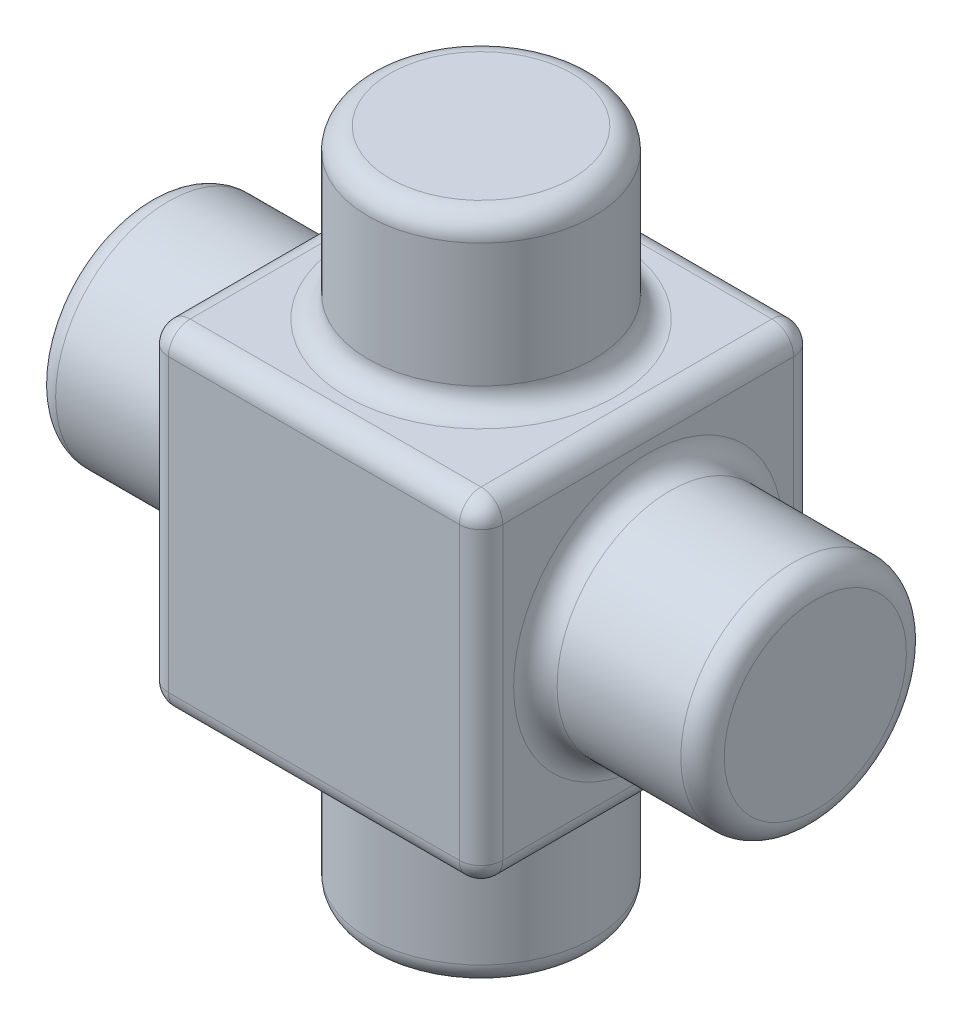
ISO-10303-21;
HEADER;
FILE_DESCRIPTION(('STEP AP214'),'2;1');
FILE_NAME('part.step','',(''),(''),'','','');
FILE_SCHEMA(('AUTOMOTIVE_DESIGN { 1 0 10303 214 1 1 1 1 }'));
ENDSEC;
DATA;
#1=APPLICATION_CONTEXT('core data for automotive mechanical design processes');
#2=APPLICATION_PROTOCOL_DEFINITION('international standard','automotive_design',2000,#1);
#3=PRODUCT_CONTEXT('',#1,'mechanical');
#4=PRODUCT('Part','Part','',(#3));
#5=PRODUCT_RELATED_PRODUCT_CATEGORY('part','',(#4));
#6=PRODUCT_DEFINITION_FORMATION('','',#4);
#7=PRODUCT_DEFINITION_CONTEXT('part definition',#1,'design');
#8=PRODUCT_DEFINITION('design','',#6,#7);
#9=PRODUCT_DEFINITION_SHAPE('','',#8);
#10=(LENGTH_UNIT() NAMED_UNIT(*) SI_UNIT(.MILLI.,.METRE.));
#11=(NAMED_UNIT(*) PLANE_ANGLE_UNIT() SI_UNIT($,.RADIAN.));
#12=(NAMED_UNIT(*) SI_UNIT($,.STERADIAN.) SOLID_ANGLE_UNIT());
#13=UNCERTAINTY_MEASURE_WITH_UNIT(LENGTH_MEASURE(1.E-05),#10,'distance_accuracy_value','');
#14=(GEOMETRIC_REPRESENTATION_CONTEXT(3) GLOBAL_UNCERTAINTY_ASSIGNED_CONTEXT((#13)) GLOBAL_UNIT_ASSIGNED_CONTEXT((#10,
#11,#12)) REPRESENTATION_CONTEXT('',''));
#15=CARTESIAN_POINT('',(0.,0.,0.));
#16=DIRECTION('',(0.,0.,1.));
#17=DIRECTION('',(1.,0.,0.));
#18=AXIS2_PLACEMENT_3D('',#15,#16,#17);
#19=CARTESIAN_POINT('',(0.,25.4,25.4));
#20=DIRECTION('',(0.,0.,-1.));
#21=DIRECTION('',(-1.,0.,0.));
#22=AXIS2_PLACEMENT_3D('',#19,#20,#21);
#23=PLANE('',#22);
#24=DIRECTION('',(1.,0.,0.));
#25=VECTOR('',#24,1.);
#26=CARTESIAN_POINT('',(-25.4,22.098,25.4));
#27=LINE('',#26,#25);
#28=CARTESIAN_POINT('',(22.098,22.098,25.4));
#29=VERTEX_POINT('',#28);
#30=CARTESIAN_POINT('',(-22.098,22.098,25.4));
#31=VERTEX_POINT('',#30);
#32=EDGE_CURVE('E45',#29,#31,#27,.F.);
#33=ORIENTED_EDGE('',*,*,#32,.T.);
#34=DIRECTION('',(0.,-1.,0.));
#35=VECTOR('',#34,1.);
#36=CARTESIAN_POINT('',(-22.098,-25.4,25.4));
#37=LINE('',#36,#35);
#38=CARTESIAN_POINT('',(-22.098,-22.098,25.4));
#39=VERTEX_POINT('',#38);
#40=EDGE_CURVE('E11',#31,#39,#37,.T.);
#41=ORIENTED_EDGE('',*,*,#40,.T.);
#42=DIRECTION('',(1.,0.,0.));
#43=VECTOR('',#42,1.);
#44=CARTESIAN_POINT('',(0.,-22.098,25.4));
#45=LINE('',#44,#43);
#46=CARTESIAN_POINT('',(22.098,-22.098,25.4));
#47=VERTEX_POINT('',#46);
#48=EDGE_CURVE('E217',#39,#47,#45,.T.);
#49=ORIENTED_EDGE('',*,*,#48,.T.);
#50=DIRECTION('',(0.,-1.,0.));
#51=VECTOR('',#50,1.);
#52=CARTESIAN_POINT('',(22.098,25.4,25.4));
#53=LINE('',#52,#51);
#54=EDGE_CURVE('E56',#47,#29,#53,.F.);
#55=ORIENTED_EDGE('',*,*,#54,.T.);
#56=EDGE_LOOP('',(#33,#41,#49,#55));
#57=FACE_BOUND('',#56,.T.);
#58=ADVANCED_FACE('F36',(#57),#23,.F.);
#59=CARTESIAN_POINT('',(25.4,25.4,0.));
#60=DIRECTION('',(-1.,0.,0.));
#61=DIRECTION('',(0.,0.,1.));
#62=AXIS2_PLACEMENT_3D('',#59,#60,#61);
#63=PLANE('',#62);
#64=CARTESIAN_POINT('',(25.4,0.,0.));
#65=DIRECTION('',(-1.,0.,0.));
#66=DIRECTION('',(0.,0.,1.));
#67=AXIS2_PLACEMENT_3D('',#64,#65,#66);
#68=CIRCLE('',#67,20.447);
#69=CARTESIAN_POINT('',(25.4,0.,20.447));
#70=VERTEX_POINT('',#69);
#71=EDGE_CURVE('E202',#70,#70,#68,.T.);
#72=ORIENTED_EDGE('',*,*,#71,.T.);
#73=EDGE_LOOP('',(#72));
#74=FACE_BOUND('',#73,.T.);
#75=DIRECTION('',(0.,0.,-1.));
#76=VECTOR('',#75,1.);
#77=CARTESIAN_POINT('',(25.4,-22.098,0.));
#78=LINE('',#77,#76);
#79=CARTESIAN_POINT('',(25.4,-22.098,22.098));
#80=VERTEX_POINT('',#79);
#81=CARTESIAN_POINT('',(25.4,-22.098,-22.098));
#82=VERTEX_POINT('',#81);
#83=EDGE_CURVE('E142',#80,#82,#78,.T.);
#84=ORIENTED_EDGE('',*,*,#83,.T.);
#85=DIRECTION('',(0.,-1.,0.));
#86=VECTOR('',#85,1.);
#87=CARTESIAN_POINT('',(25.4,25.4,-22.098));
#88=LINE('',#87,#86);
#89=CARTESIAN_POINT('',(25.4,22.098,-22.098));
#90=VERTEX_POINT('',#89);
#91=EDGE_CURVE('E199',#82,#90,#88,.F.);
#92=ORIENTED_EDGE('',*,*,#91,.T.);
#93=DIRECTION('',(0.,0.,-1.));
#94=VECTOR('',#93,1.);
#95=CARTESIAN_POINT('',(25.4,22.098,25.4));
#96=LINE('',#95,#94);
#97=CARTESIAN_POINT('',(25.4,22.098,22.098));
#98=VERTEX_POINT('',#97);
#99=EDGE_CURVE('E196',#90,#98,#96,.F.);
#100=ORIENTED_EDGE('',*,*,#99,.T.);
#101=DIRECTION('',(0.,-1.,0.));
#102=VECTOR('',#101,1.);
#103=CARTESIAN_POINT('',(25.4,25.4,22.098));
#104=LINE('',#103,#102);
#105=EDGE_CURVE('E194',#98,#80,#104,.T.);
#106=ORIENTED_EDGE('',*,*,#105,.T.);
#107=EDGE_LOOP('',(#84,#92,#100,#106));
#108=FACE_BOUND('',#107,.T.);
#109=ADVANCED_FACE('F332',(#74,#108),#63,.F.);
#110=CARTESIAN_POINT('',(0.,25.4,-25.4));
#111=DIRECTION('',(0.,0.,-1.));
#112=DIRECTION('',(-1.,0.,0.));
#113=AXIS2_PLACEMENT_3D('',#110,#111,#112);
#114=PLANE('',#113);
#115=DIRECTION('',(1.,0.,0.));
#116=VECTOR('',#115,1.);
#117=CARTESIAN_POINT('',(-25.4,-22.098,-25.4));
#118=LINE('',#117,#116);
#119=CARTESIAN_POINT('',(22.098,-22.098,-25.4));
#120=VERTEX_POINT('',#119);
#121=CARTESIAN_POINT('',(-22.098,-22.098,-25.4));
#122=VERTEX_POINT('',#121);
#123=EDGE_CURVE('E189',#120,#122,#118,.F.);
#124=ORIENTED_EDGE('',*,*,#123,.T.);
#125=DIRECTION('',(0.,-1.,0.));
#126=VECTOR('',#125,1.);
#127=CARTESIAN_POINT('',(-22.098,25.4,-25.4));
#128=LINE('',#127,#126);
#129=CARTESIAN_POINT('',(-22.098,22.098,-25.4));
#130=VERTEX_POINT('',#129);
#131=EDGE_CURVE('E191',#122,#130,#128,.F.);
#132=ORIENTED_EDGE('',*,*,#131,.T.);
#133=DIRECTION('',(1.,0.,0.));
#134=VECTOR('',#133,1.);
#135=CARTESIAN_POINT('',(0.,22.098,-25.4));
#136=LINE('',#135,#134);
#137=CARTESIAN_POINT('',(22.098,22.098,-25.4));
#138=VERTEX_POINT('',#137);
#139=EDGE_CURVE('E185',#130,#138,#136,.T.);
#140=ORIENTED_EDGE('',*,*,#139,.T.);
#141=DIRECTION('',(0.,-1.,0.));
#142=VECTOR('',#141,1.);
#143=CARTESIAN_POINT('',(22.098,-25.4,-25.4));
#144=LINE('',#143,#142);
#145=EDGE_CURVE('E187',#138,#120,#144,.T.);
#146=ORIENTED_EDGE('',*,*,#145,.T.);
#147=EDGE_LOOP('',(#124,#132,#140,#146));
#148=FACE_BOUND('',#147,.T.);
#149=ADVANCED_FACE('F337',(#148),#114,.T.);
#150=CARTESIAN_POINT('',(-25.4,25.4,0.));
#151=DIRECTION('',(-1.,0.,0.));
#152=DIRECTION('',(0.,0.,1.));
#153=AXIS2_PLACEMENT_3D('',#150,#151,#152);
#154=PLANE('',#153);
#155=CARTESIAN_POINT('',(-25.4,0.,0.));
#156=DIRECTION('',(-1.,0.,0.));
#157=DIRECTION('',(0.,0.,1.));
#158=AXIS2_PLACEMENT_3D('',#155,#156,#157);
#159=CIRCLE('',#158,20.447);
#160=CARTESIAN_POINT('',(-25.4,0.,20.447));
#161=VERTEX_POINT('',#160);
#162=EDGE_CURVE('E182',#161,#161,#159,.F.);
#163=ORIENTED_EDGE('',*,*,#162,.T.);
#164=EDGE_LOOP('',(#163));
#165=FACE_BOUND('',#164,.T.);
#166=DIRECTION('',(0.,-1.,0.));
#167=VECTOR('',#166,1.);
#168=CARTESIAN_POINT('',(-25.4,25.4,-22.098));
#169=LINE('',#168,#167);
#170=CARTESIAN_POINT('',(-25.4,22.098,-22.098));
#171=VERTEX_POINT('',#170);
#172=CARTESIAN_POINT('',(-25.4,-22.098,-22.098));
#173=VERTEX_POINT('',#172);
#174=EDGE_CURVE('E177',#171,#173,#169,.T.);
#175=ORIENTED_EDGE('',*,*,#174,.T.);
#176=DIRECTION('',(0.,0.,-1.));
#177=VECTOR('',#176,1.);
#178=CARTESIAN_POINT('',(-25.4,-22.098,25.4));
#179=LINE('',#178,#177);
#180=CARTESIAN_POINT('',(-25.4,-22.098,22.098));
#181=VERTEX_POINT('',#180);
#182=EDGE_CURVE('E179',#173,#181,#179,.F.);
#183=ORIENTED_EDGE('',*,*,#182,.T.);
#184=DIRECTION('',(0.,-1.,0.));
#185=VECTOR('',#184,1.);
#186=CARTESIAN_POINT('',(-25.4,25.4,22.098));
#187=LINE('',#186,#185);
#188=CARTESIAN_POINT('',(-25.4,22.098,22.098));
#189=VERTEX_POINT('',#188);
#190=EDGE_CURVE('E173',#181,#189,#187,.F.);
#191=ORIENTED_EDGE('',*,*,#190,.T.);
#192=DIRECTION('',(0.,0.,-1.));
#193=VECTOR('',#192,1.);
#194=CARTESIAN_POINT('',(-25.4,22.098,0.));
#195=LINE('',#194,#193);
#196=EDGE_CURVE('E175',#189,#171,#195,.T.);
#197=ORIENTED_EDGE('',*,*,#196,.T.);
#198=EDGE_LOOP('',(#175,#183,#191,#197));
#199=FACE_BOUND('',#198,.T.);
#200=ADVANCED_FACE('F462',(#165,#199),#154,.T.);
#201=CARTESIAN_POINT('',(0.,25.4,0.));
#202=DIRECTION('',(0.,1.,0.));
#203=DIRECTION('',(0.,0.,1.));
#204=AXIS2_PLACEMENT_3D('',#201,#202,#203);
#205=PLANE('',#204);
#206=CARTESIAN_POINT('',(0.,25.4,0.));
#207=DIRECTION('',(0.,1.,0.));
#208=DIRECTION('',(0.,0.,1.));
#209=AXIS2_PLACEMENT_3D('',#206,#207,#208);
#210=CIRCLE('',#209,20.447);
#211=CARTESIAN_POINT('',(0.,25.4,20.447));
#212=VERTEX_POINT('',#211);
#213=EDGE_CURVE('E214',#212,#212,#210,.F.);
#214=ORIENTED_EDGE('',*,*,#213,.T.);
#215=EDGE_LOOP('',(#214));
#216=FACE_BOUND('',#215,.T.);
#217=DIRECTION('',(1.,0.,0.));
#218=VECTOR('',#217,1.);
#219=CARTESIAN_POINT('',(0.,25.4,-22.098));
#220=LINE('',#219,#218);
#221=CARTESIAN_POINT('',(22.098,25.4,-22.098));
#222=VERTEX_POINT('',#221);
#223=CARTESIAN_POINT('',(-22.098,25.4,-22.098));
#224=VERTEX_POINT('',#223);
#225=EDGE_CURVE('E209',#222,#224,#220,.F.);
#226=ORIENTED_EDGE('',*,*,#225,.T.);
#227=DIRECTION('',(0.,0.,-1.));
#228=VECTOR('',#227,1.);
#229=CARTESIAN_POINT('',(-22.098,25.4,0.));
#230=LINE('',#229,#228);
#231=CARTESIAN_POINT('',(-22.098,25.4,22.098));
#232=VERTEX_POINT('',#231);
#233=EDGE_CURVE('E211',#224,#232,#230,.F.);
#234=ORIENTED_EDGE('',*,*,#233,.T.);
#235=DIRECTION('',(1.,0.,0.));
#236=VECTOR('',#235,1.);
#237=CARTESIAN_POINT('',(25.4,25.4,22.098));
#238=LINE('',#237,#236);
#239=CARTESIAN_POINT('',(22.098,25.4,22.098));
#240=VERTEX_POINT('',#239);
#241=EDGE_CURVE('E205',#232,#240,#238,.T.);
#242=ORIENTED_EDGE('',*,*,#241,.T.);
#243=DIRECTION('',(0.,0.,-1.));
#244=VECTOR('',#243,1.);
#245=CARTESIAN_POINT('',(22.098,25.4,-25.4));
#246=LINE('',#245,#244);
#247=EDGE_CURVE('E207',#240,#222,#246,.T.);
#248=ORIENTED_EDGE('',*,*,#247,.T.);
#249=EDGE_LOOP('',(#226,#234,#242,#248));
#250=FACE_BOUND('',#249,.T.);
#251=ADVANCED_FACE('F451',(#216,#250),#205,.T.);
#252=CARTESIAN_POINT('',(0.,-25.4,0.));
#253=DIRECTION('',(0.,1.,0.));
#254=DIRECTION('',(0.,0.,1.));
#255=AXIS2_PLACEMENT_3D('',#252,#253,#254);
#256=PLANE('',#255);
#257=CARTESIAN_POINT('',(0.,-25.4,0.));
#258=DIRECTION('',(0.,1.,0.));
#259=DIRECTION('',(0.,0.,1.));
#260=AXIS2_PLACEMENT_3D('',#257,#258,#259);
#261=CIRCLE('',#260,20.447);
#262=CARTESIAN_POINT('',(0.,-25.4,20.447));
#263=VERTEX_POINT('',#262);
#264=EDGE_CURVE('E170',#263,#263,#261,.T.);
#265=ORIENTED_EDGE('',*,*,#264,.T.);
#266=EDGE_LOOP('',(#265));
#267=FACE_BOUND('',#266,.T.);
#268=DIRECTION('',(1.,0.,0.));
#269=VECTOR('',#268,1.);
#270=CARTESIAN_POINT('',(0.,-25.4,22.098));
#271=LINE('',#270,#269);
#272=CARTESIAN_POINT('',(22.098,-25.4,22.098));
#273=VERTEX_POINT('',#272);
#274=CARTESIAN_POINT('',(-22.098,-25.4,22.098));
#275=VERTEX_POINT('',#274);
#276=EDGE_CURVE('E129',#273,#275,#271,.F.);
#277=ORIENTED_EDGE('',*,*,#276,.T.);
#278=DIRECTION('',(0.,0.,-1.));
#279=VECTOR('',#278,1.);
#280=CARTESIAN_POINT('',(-22.098,-25.4,-25.4));
#281=LINE('',#280,#279);
#282=CARTESIAN_POINT('',(-22.098,-25.4,-22.098));
#283=VERTEX_POINT('',#282);
#284=EDGE_CURVE('E168',#275,#283,#281,.T.);
#285=ORIENTED_EDGE('',*,*,#284,.T.);
#286=DIRECTION('',(1.,0.,0.));
#287=VECTOR('',#286,1.);
#288=CARTESIAN_POINT('',(25.4,-25.4,-22.098));
#289=LINE('',#288,#287);
#290=CARTESIAN_POINT('',(22.098,-25.4,-22.098));
#291=VERTEX_POINT('',#290);
#292=EDGE_CURVE('E132',#283,#291,#289,.T.);
#293=ORIENTED_EDGE('',*,*,#292,.T.);
#294=DIRECTION('',(0.,0.,-1.));
#295=VECTOR('',#294,1.);
#296=CARTESIAN_POINT('',(22.098,-25.4,0.));
#297=LINE('',#296,#295);
#298=EDGE_CURVE('E124',#291,#273,#297,.F.);
#299=ORIENTED_EDGE('',*,*,#298,.T.);
#300=EDGE_LOOP('',(#277,#285,#293,#299));
#301=FACE_BOUND('',#300,.T.);
#302=ADVANCED_FACE('F126',(#267,#301),#256,.F.);
#303=CARTESIAN_POINT('',(0.,-50.8,0.));
#304=DIRECTION('',(0.,1.,0.));
#305=DIRECTION('',(0.,0.,1.));
#306=AXIS2_PLACEMENT_3D('',#303,#304,#305);
#307=PLANE('',#306);
#308=CARTESIAN_POINT('',(0.,-50.8,0.));
#309=DIRECTION('',(0.,1.,0.));
#310=DIRECTION('',(0.,0.,1.));
#311=AXIS2_PLACEMENT_3D('',#308,#309,#310);
#312=CIRCLE('',#311,13.843);
#313=CARTESIAN_POINT('',(0.,-50.8,13.843));
#314=VERTEX_POINT('',#313);
#315=EDGE_CURVE('E285',#314,#314,#312,.F.);
#316=ORIENTED_EDGE('',*,*,#315,.T.);
#317=EDGE_LOOP('',(#316));
#318=FACE_BOUND('',#317,.T.);
#319=ADVANCED_FACE('F474',(#318),#307,.F.);
#320=CARTESIAN_POINT('',(0.,50.8,0.));
#321=DIRECTION('',(0.,-1.,0.));
#322=DIRECTION('',(0.,0.,-1.));
#323=AXIS2_PLACEMENT_3D('',#320,#321,#322);
#324=CYLINDRICAL_SURFACE('',#323,17.145);
#325=CARTESIAN_POINT('',(0.,-47.498,0.));
#326=DIRECTION('',(0.,1.,0.));
#327=DIRECTION('',(0.,0.,1.));
#328=AXIS2_PLACEMENT_3D('',#325,#326,#327);
#329=CIRCLE('',#328,17.145);
#330=CARTESIAN_POINT('',(0.,-47.498,17.145));
#331=VERTEX_POINT('',#330);
#332=EDGE_CURVE('E280',#331,#331,#329,.T.);
#333=ORIENTED_EDGE('',*,*,#332,.T.);
#334=EDGE_LOOP('',(#333));
#335=FACE_BOUND('',#334,.T.);
#336=CARTESIAN_POINT('',(0.,-28.702,0.));
#337=DIRECTION('',(0.,1.,0.));
#338=DIRECTION('',(0.,0.,1.));
#339=AXIS2_PLACEMENT_3D('',#336,#337,#338);
#340=CIRCLE('',#339,17.145);
#341=CARTESIAN_POINT('',(0.,-28.702,17.145));
#342=VERTEX_POINT('',#341);
#343=EDGE_CURVE('E274',#342,#342,#340,.F.);
#344=ORIENTED_EDGE('',*,*,#343,.T.);
#345=EDGE_LOOP('',(#344));
#346=FACE_BOUND('',#345,.T.);
#347=ADVANCED_FACE('F481',(#335,#346),#324,.T.);
#348=CARTESIAN_POINT('',(0.,47.498,0.));
#349=DIRECTION('',(0.,1.,0.));
#350=DIRECTION('',(0.,0.,1.));
#351=AXIS2_PLACEMENT_3D('',#348,#349,#350);
#352=CIRCLE('',#351,17.145);
#353=CARTESIAN_POINT('',(0.,47.498,17.145));
#354=VERTEX_POINT('',#353);
#355=EDGE_CURVE('E305',#354,#354,#352,.F.);
#356=ORIENTED_EDGE('',*,*,#355,.T.);
#357=EDGE_LOOP('',(#356));
#358=FACE_BOUND('',#357,.T.);
#359=CARTESIAN_POINT('',(0.,28.702,0.));
#360=DIRECTION('',(0.,1.,0.));
#361=DIRECTION('',(0.,0.,1.));
#362=AXIS2_PLACEMENT_3D('',#359,#360,#361);
#363=CIRCLE('',#362,17.145);
#364=CARTESIAN_POINT('',(0.,28.702,17.145));
#365=VERTEX_POINT('',#364);
#366=EDGE_CURVE('E302',#365,#365,#363,.T.);
#367=ORIENTED_EDGE('',*,*,#366,.T.);
#368=EDGE_LOOP('',(#367));
#369=FACE_BOUND('',#368,.T.);
#370=ADVANCED_FACE('F477',(#358,#369),#324,.T.);
#371=CARTESIAN_POINT('',(0.,50.8,0.));
#372=DIRECTION('',(0.,1.,0.));
#373=DIRECTION('',(0.,0.,1.));
#374=AXIS2_PLACEMENT_3D('',#371,#372,#373);
#375=PLANE('',#374);
#376=CARTESIAN_POINT('',(0.,50.8,0.));
#377=DIRECTION('',(0.,1.,0.));
#378=DIRECTION('',(0.,0.,1.));
#379=AXIS2_PLACEMENT_3D('',#376,#377,#378);
#380=CIRCLE('',#379,13.843);
#381=CARTESIAN_POINT('',(0.,50.8,13.843));
#382=VERTEX_POINT('',#381);
#383=EDGE_CURVE('E299',#382,#382,#380,.T.);
#384=ORIENTED_EDGE('',*,*,#383,.T.);
#385=EDGE_LOOP('',(#384));
#386=FACE_BOUND('',#385,.T.);
#387=ADVANCED_FACE('F480',(#386),#375,.T.);
#388=CARTESIAN_POINT('',(-50.8,0.,0.));
#389=DIRECTION('',(1.,0.,0.));
#390=DIRECTION('',(0.,0.,1.));
#391=AXIS2_PLACEMENT_3D('',#388,#389,#390);
#392=PLANE('',#391);
#393=CARTESIAN_POINT('',(-50.8,0.,0.));
#394=DIRECTION('',(1.,0.,0.));
#395=DIRECTION('',(0.,1.,0.));
#396=AXIS2_PLACEMENT_3D('',#393,#394,#395);
#397=CIRCLE('',#396,13.843);
#398=CARTESIAN_POINT('',(-50.8,13.843,0.));
#399=VERTEX_POINT('',#398);
#400=EDGE_CURVE('E308',#399,#399,#397,.F.);
#401=ORIENTED_EDGE('',*,*,#400,.T.);
#402=EDGE_LOOP('',(#401));
#403=FACE_BOUND('',#402,.T.);
#404=ADVANCED_FACE('F488',(#403),#392,.F.);
#405=CARTESIAN_POINT('',(50.8,0.,0.));
#406=DIRECTION('',(-1.,0.,0.));
#407=DIRECTION('',(0.,-1.,0.));
#408=AXIS2_PLACEMENT_3D('',#405,#406,#407);
#409=CYLINDRICAL_SURFACE('',#408,17.145);
#410=CARTESIAN_POINT('',(-47.498,0.,0.));
#411=DIRECTION('',(1.,0.,0.));
#412=DIRECTION('',(0.,1.,0.));
#413=AXIS2_PLACEMENT_3D('',#410,#411,#412);
#414=CIRCLE('',#413,17.145);
#415=CARTESIAN_POINT('',(-47.498,17.145,0.));
#416=VERTEX_POINT('',#415);
#417=EDGE_CURVE('E160',#416,#416,#414,.T.);
#418=ORIENTED_EDGE('',*,*,#417,.T.);
#419=EDGE_LOOP('',(#418));
#420=FACE_BOUND('',#419,.T.);
#421=CARTESIAN_POINT('',(-28.702,0.,0.));
#422=DIRECTION('',(-1.,0.,0.));
#423=DIRECTION('',(0.,0.,1.));
#424=AXIS2_PLACEMENT_3D('',#421,#422,#423);
#425=CIRCLE('',#424,17.145);
#426=CARTESIAN_POINT('',(-28.702,0.,17.145));
#427=VERTEX_POINT('',#426);
#428=EDGE_CURVE('E163',#427,#427,#425,.T.);
#429=ORIENTED_EDGE('',*,*,#428,.T.);
#430=EDGE_LOOP('',(#429));
#431=FACE_BOUND('',#430,.T.);
#432=ADVANCED_FACE('F313',(#420,#431),#409,.T.);
#433=CARTESIAN_POINT('',(47.498,0.,0.));
#434=DIRECTION('',(1.,0.,0.));
#435=DIRECTION('',(0.,1.,0.));
#436=AXIS2_PLACEMENT_3D('',#433,#434,#435);
#437=CIRCLE('',#436,17.145);
#438=CARTESIAN_POINT('',(47.498,17.145,0.));
#439=VERTEX_POINT('',#438);
#440=EDGE_CURVE('E293',#439,#439,#437,.F.);
#441=ORIENTED_EDGE('',*,*,#440,.T.);
#442=EDGE_LOOP('',(#441));
#443=FACE_BOUND('',#442,.T.);
#444=CARTESIAN_POINT('',(28.702,0.,0.));
#445=DIRECTION('',(-1.,0.,0.));
#446=DIRECTION('',(0.,0.,1.));
#447=AXIS2_PLACEMENT_3D('',#444,#445,#446);
#448=CIRCLE('',#447,17.145);
#449=CARTESIAN_POINT('',(28.702,0.,17.145));
#450=VERTEX_POINT('',#449);
#451=EDGE_CURVE('E290',#450,#450,#448,.F.);
#452=ORIENTED_EDGE('',*,*,#451,.T.);
#453=EDGE_LOOP('',(#452));
#454=FACE_BOUND('',#453,.T.);
#455=ADVANCED_FACE('F492',(#443,#454),#409,.T.);
#456=CARTESIAN_POINT('',(50.8,0.,0.));
#457=DIRECTION('',(1.,0.,0.));
#458=DIRECTION('',(0.,0.,1.));
#459=AXIS2_PLACEMENT_3D('',#456,#457,#458);
#460=PLANE('',#459);
#461=CARTESIAN_POINT('',(50.8,0.,0.));
#462=DIRECTION('',(1.,0.,0.));
#463=DIRECTION('',(0.,1.,0.));
#464=AXIS2_PLACEMENT_3D('',#461,#462,#463);
#465=CIRCLE('',#464,13.843);
#466=CARTESIAN_POINT('',(50.8,13.843,0.));
#467=VERTEX_POINT('',#466);
#468=EDGE_CURVE('E296',#467,#467,#465,.T.);
#469=ORIENTED_EDGE('',*,*,#468,.T.);
#470=EDGE_LOOP('',(#469));
#471=FACE_BOUND('',#470,.T.);
#472=ADVANCED_FACE('F346',(#471),#460,.T.);
#473=CARTESIAN_POINT('',(0.,-47.498,0.));
#474=DIRECTION('',(0.,1.,0.));
#475=DIRECTION('',(0.,0.,1.));
#476=AXIS2_PLACEMENT_3D('',#473,#474,#475);
#477=TOROIDAL_SURFACE('',#476,13.843,3.302);
#478=ORIENTED_EDGE('',*,*,#315,.F.);
#479=EDGE_LOOP('',(#478));
#480=FACE_BOUND('',#479,.T.);
#481=ORIENTED_EDGE('',*,*,#332,.F.);
#482=EDGE_LOOP('',(#481));
#483=FACE_BOUND('',#482,.T.);
#484=ADVANCED_FACE('F342',(#480,#483),#477,.T.);
#485=CARTESIAN_POINT('',(47.498,0.,0.));
#486=DIRECTION('',(1.,0.,0.));
#487=DIRECTION('',(0.,1.,0.));
#488=AXIS2_PLACEMENT_3D('',#485,#486,#487);
#489=TOROIDAL_SURFACE('',#488,13.843,3.302);
#490=ORIENTED_EDGE('',*,*,#468,.F.);
#491=EDGE_LOOP('',(#490));
#492=FACE_BOUND('',#491,.T.);
#493=ORIENTED_EDGE('',*,*,#440,.F.);
#494=EDGE_LOOP('',(#493));
#495=FACE_BOUND('',#494,.T.);
#496=ADVANCED_FACE('F345',(#492,#495),#489,.T.);
#497=CARTESIAN_POINT('',(0.,47.498,0.));
#498=DIRECTION('',(0.,1.,0.));
#499=DIRECTION('',(0.,0.,1.));
#500=AXIS2_PLACEMENT_3D('',#497,#498,#499);
#501=TOROIDAL_SURFACE('',#500,13.843,3.302);
#502=ORIENTED_EDGE('',*,*,#355,.F.);
#503=EDGE_LOOP('',(#502));
#504=FACE_BOUND('',#503,.T.);
#505=ORIENTED_EDGE('',*,*,#383,.F.);
#506=EDGE_LOOP('',(#505));
#507=FACE_BOUND('',#506,.T.);
#508=ADVANCED_FACE('F350',(#504,#507),#501,.T.);
#509=CARTESIAN_POINT('',(-47.498,0.,0.));
#510=DIRECTION('',(1.,0.,0.));
#511=DIRECTION('',(0.,1.,0.));
#512=AXIS2_PLACEMENT_3D('',#509,#510,#511);
#513=TOROIDAL_SURFACE('',#512,13.843,3.302);
#514=ORIENTED_EDGE('',*,*,#417,.F.);
#515=EDGE_LOOP('',(#514));
#516=FACE_BOUND('',#515,.T.);
#517=ORIENTED_EDGE('',*,*,#400,.F.);
#518=EDGE_LOOP('',(#517));
#519=FACE_BOUND('',#518,.T.);
#520=ADVANCED_FACE('F354',(#516,#519),#513,.T.);
#521=CARTESIAN_POINT('',(0.,-28.702,0.));
#522=DIRECTION('',(0.,1.,0.));
#523=DIRECTION('',(0.,0.,1.));
#524=AXIS2_PLACEMENT_3D('',#521,#522,#523);
#525=TOROIDAL_SURFACE('',#524,20.447,3.302);
#526=ORIENTED_EDGE('',*,*,#264,.F.);
#527=EDGE_LOOP('',(#526));
#528=FACE_BOUND('',#527,.T.);
#529=ORIENTED_EDGE('',*,*,#343,.F.);
#530=EDGE_LOOP('',(#529));
#531=FACE_BOUND('',#530,.T.);
#532=ADVANCED_FACE('F358',(#528,#531),#525,.F.);
#533=CARTESIAN_POINT('',(22.098,22.098,0.));
#534=DIRECTION('',(0.,0.,1.));
#535=DIRECTION('',(1.,0.,0.));
#536=AXIS2_PLACEMENT_3D('',#533,#534,#535);
#537=CYLINDRICAL_SURFACE('',#536,3.302);
#538=CARTESIAN_POINT('',(22.098,22.098,22.098));
#539=DIRECTION('',(0.,0.,1.));
#540=DIRECTION('',(1.,0.,0.));
#541=AXIS2_PLACEMENT_3D('',#538,#539,#540);
#542=CIRCLE('',#541,3.302);
#543=EDGE_CURVE('E40',#98,#240,#542,.T.);
#544=ORIENTED_EDGE('',*,*,#543,.F.);
#545=ORIENTED_EDGE('',*,*,#99,.F.);
#546=CARTESIAN_POINT('',(22.098,22.098,-22.098));
#547=DIRECTION('',(0.,0.,-1.));
#548=DIRECTION('',(-1.,0.,0.));
#549=AXIS2_PLACEMENT_3D('',#546,#547,#548);
#550=CIRCLE('',#549,3.302);
#551=EDGE_CURVE('E266',#222,#90,#550,.T.);
#552=ORIENTED_EDGE('',*,*,#551,.F.);
#553=ORIENTED_EDGE('',*,*,#247,.F.);
#554=EDGE_LOOP('',(#544,#545,#552,#553));
#555=FACE_BOUND('',#554,.T.);
#556=ADVANCED_FACE('F361',(#555),#537,.T.);
#557=CARTESIAN_POINT('',(22.098,22.098,22.098));
#558=DIRECTION('',(0.,0.,1.));
#559=DIRECTION('',(1.,0.,0.));
#560=AXIS2_PLACEMENT_3D('',#557,#558,#559);
#561=SPHERICAL_SURFACE('',#560,3.302);
#562=CARTESIAN_POINT('',(22.098,22.098,22.098));
#563=DIRECTION('',(0.,1.,0.));
#564=DIRECTION('',(0.,0.,1.));
#565=AXIS2_PLACEMENT_3D('',#562,#563,#564);
#566=CIRCLE('',#565,3.302);
#567=EDGE_CURVE('E262',#98,#29,#566,.F.);
#568=ORIENTED_EDGE('',*,*,#567,.F.);
#569=ORIENTED_EDGE('',*,*,#543,.T.);
#570=CARTESIAN_POINT('',(22.098,22.098,22.098));
#571=DIRECTION('',(1.,0.,0.));
#572=DIRECTION('',(0.,0.,-1.));
#573=AXIS2_PLACEMENT_3D('',#570,#571,#572);
#574=CIRCLE('',#573,3.302);
#575=EDGE_CURVE('E264',#29,#240,#574,.F.);
#576=ORIENTED_EDGE('',*,*,#575,.F.);
#577=EDGE_LOOP('',(#568,#569,#576));
#578=FACE_BOUND('',#577,.T.);
#579=ADVANCED_FACE('F424',(#578),#561,.T.);
#580=CARTESIAN_POINT('',(22.098,22.098,-22.098));
#581=DIRECTION('',(0.,0.,1.));
#582=DIRECTION('',(1.,0.,0.));
#583=AXIS2_PLACEMENT_3D('',#580,#581,#582);
#584=SPHERICAL_SURFACE('',#583,3.302);
#585=CARTESIAN_POINT('',(22.098,22.098,-22.098));
#586=DIRECTION('',(1.,0.,0.));
#587=DIRECTION('',(0.,0.,-1.));
#588=AXIS2_PLACEMENT_3D('',#585,#586,#587);
#589=CIRCLE('',#588,3.302);
#590=EDGE_CURVE('E257',#222,#138,#589,.F.);
#591=ORIENTED_EDGE('',*,*,#590,.F.);
#592=ORIENTED_EDGE('',*,*,#551,.T.);
#593=CARTESIAN_POINT('',(22.098,22.098,-22.098));
#594=DIRECTION('',(0.,1.,0.));
#595=DIRECTION('',(0.,0.,1.));
#596=AXIS2_PLACEMENT_3D('',#593,#594,#595);
#597=CIRCLE('',#596,3.302);
#598=EDGE_CURVE('E260',#138,#90,#597,.F.);
#599=ORIENTED_EDGE('',*,*,#598,.F.);
#600=EDGE_LOOP('',(#591,#592,#599));
#601=FACE_BOUND('',#600,.T.);
#602=ADVANCED_FACE('F420',(#601),#584,.T.);
#603=CARTESIAN_POINT('',(0.,22.098,22.098));
#604=DIRECTION('',(-1.,0.,0.));
#605=DIRECTION('',(0.,0.,1.));
#606=AXIS2_PLACEMENT_3D('',#603,#604,#605);
#607=CYLINDRICAL_SURFACE('',#606,3.302);
#608=ORIENTED_EDGE('',*,*,#575,.T.);
#609=ORIENTED_EDGE('',*,*,#241,.F.);
#610=CARTESIAN_POINT('',(-22.098,22.098,22.098));
#611=DIRECTION('',(-1.,0.,0.));
#612=DIRECTION('',(0.,0.,1.));
#613=AXIS2_PLACEMENT_3D('',#610,#611,#612);
#614=CIRCLE('',#613,3.302);
#615=EDGE_CURVE('E252',#31,#232,#614,.T.);
#616=ORIENTED_EDGE('',*,*,#615,.F.);
#617=ORIENTED_EDGE('',*,*,#32,.F.);
#618=EDGE_LOOP('',(#608,#609,#616,#617));
#619=FACE_BOUND('',#618,.T.);
#620=ADVANCED_FACE('F416',(#619),#607,.T.);
#621=CARTESIAN_POINT('',(22.098,25.4,22.098));
#622=DIRECTION('',(0.,-1.,0.));
#623=DIRECTION('',(0.,0.,-1.));
#624=AXIS2_PLACEMENT_3D('',#621,#622,#623);
#625=CYLINDRICAL_SURFACE('',#624,3.302);
#626=ORIENTED_EDGE('',*,*,#567,.T.);
#627=ORIENTED_EDGE('',*,*,#54,.F.);
#628=CARTESIAN_POINT('',(22.098,-22.098,22.098));
#629=DIRECTION('',(0.,-1.,0.));
#630=DIRECTION('',(0.,0.,-1.));
#631=AXIS2_PLACEMENT_3D('',#628,#629,#630);
#632=CIRCLE('',#631,3.302);
#633=EDGE_CURVE('E146',#80,#47,#632,.T.);
#634=ORIENTED_EDGE('',*,*,#633,.F.);
#635=ORIENTED_EDGE('',*,*,#105,.F.);
#636=EDGE_LOOP('',(#626,#627,#634,#635));
#637=FACE_BOUND('',#636,.T.);
#638=ADVANCED_FACE('F413',(#637),#625,.T.);
#639=CARTESIAN_POINT('',(22.098,-22.098,0.));
#640=DIRECTION('',(0.,0.,-1.));
#641=DIRECTION('',(-1.,0.,0.));
#642=AXIS2_PLACEMENT_3D('',#639,#640,#641);
#643=CYLINDRICAL_SURFACE('',#642,3.302);
#644=CARTESIAN_POINT('',(22.098,-22.098,-22.098));
#645=DIRECTION('',(0.,0.,-1.));
#646=DIRECTION('',(-1.,0.,0.));
#647=AXIS2_PLACEMENT_3D('',#644,#645,#646);
#648=CIRCLE('',#647,3.302);
#649=EDGE_CURVE('E147',#82,#291,#648,.T.);
#650=ORIENTED_EDGE('',*,*,#649,.F.);
#651=ORIENTED_EDGE('',*,*,#83,.F.);
#652=CARTESIAN_POINT('',(22.098,-22.098,22.098));
#653=DIRECTION('',(0.,0.,1.));
#654=DIRECTION('',(1.,0.,0.));
#655=AXIS2_PLACEMENT_3D('',#652,#653,#654);
#656=CIRCLE('',#655,3.302);
#657=EDGE_CURVE('E139',#273,#80,#656,.T.);
#658=ORIENTED_EDGE('',*,*,#657,.F.);
#659=ORIENTED_EDGE('',*,*,#298,.F.);
#660=EDGE_LOOP('',(#650,#651,#658,#659));
#661=FACE_BOUND('',#660,.T.);
#662=ADVANCED_FACE('F141',(#661),#643,.T.);
#663=CARTESIAN_POINT('',(22.098,25.4,-22.098));
#664=DIRECTION('',(0.,1.,0.));
#665=DIRECTION('',(0.,0.,1.));
#666=AXIS2_PLACEMENT_3D('',#663,#664,#665);
#667=CYLINDRICAL_SURFACE('',#666,3.302);
#668=ORIENTED_EDGE('',*,*,#598,.T.);
#669=ORIENTED_EDGE('',*,*,#91,.F.);
#670=CARTESIAN_POINT('',(22.098,-22.098,-22.098));
#671=DIRECTION('',(0.,-1.,0.));
#672=DIRECTION('',(0.,0.,-1.));
#673=AXIS2_PLACEMENT_3D('',#670,#671,#672);
#674=CIRCLE('',#673,3.302);
#675=EDGE_CURVE('E247',#120,#82,#674,.T.);
#676=ORIENTED_EDGE('',*,*,#675,.F.);
#677=ORIENTED_EDGE('',*,*,#145,.F.);
#678=EDGE_LOOP('',(#668,#669,#676,#677));
#679=FACE_BOUND('',#678,.T.);
#680=ADVANCED_FACE('F406',(#679),#667,.T.);
#681=CARTESIAN_POINT('',(0.,22.098,-22.098));
#682=DIRECTION('',(1.,0.,0.));
#683=DIRECTION('',(0.,0.,-1.));
#684=AXIS2_PLACEMENT_3D('',#681,#682,#683);
#685=CYLINDRICAL_SURFACE('',#684,3.302);
#686=ORIENTED_EDGE('',*,*,#590,.T.);
#687=ORIENTED_EDGE('',*,*,#139,.F.);
#688=CARTESIAN_POINT('',(-22.098,22.098,-22.098));
#689=DIRECTION('',(-1.,0.,0.));
#690=DIRECTION('',(0.,0.,1.));
#691=AXIS2_PLACEMENT_3D('',#688,#689,#690);
#692=CIRCLE('',#691,3.302);
#693=EDGE_CURVE('E244',#224,#130,#692,.T.);
#694=ORIENTED_EDGE('',*,*,#693,.F.);
#695=ORIENTED_EDGE('',*,*,#225,.F.);
#696=EDGE_LOOP('',(#686,#687,#694,#695));
#697=FACE_BOUND('',#696,.T.);
#698=ADVANCED_FACE('F402',(#697),#685,.T.);
#699=CARTESIAN_POINT('',(-22.098,22.098,0.));
#700=DIRECTION('',(0.,0.,-1.));
#701=DIRECTION('',(-1.,0.,0.));
#702=AXIS2_PLACEMENT_3D('',#699,#700,#701);
#703=CYLINDRICAL_SURFACE('',#702,3.302);
#704=CARTESIAN_POINT('',(-22.098,22.098,22.098));
#705=DIRECTION('',(0.,0.,1.));
#706=DIRECTION('',(1.,0.,0.));
#707=AXIS2_PLACEMENT_3D('',#704,#705,#706);
#708=CIRCLE('',#707,3.302);
#709=EDGE_CURVE('E254',#232,#189,#708,.T.);
#710=ORIENTED_EDGE('',*,*,#709,.F.);
#711=ORIENTED_EDGE('',*,*,#233,.F.);
#712=CARTESIAN_POINT('',(-22.098,22.098,-22.098));
#713=DIRECTION('',(0.,0.,-1.));
#714=DIRECTION('',(-1.,0.,0.));
#715=AXIS2_PLACEMENT_3D('',#712,#713,#714);
#716=CIRCLE('',#715,3.302);
#717=EDGE_CURVE('E241',#171,#224,#716,.T.);
#718=ORIENTED_EDGE('',*,*,#717,.F.);
#719=ORIENTED_EDGE('',*,*,#196,.F.);
#720=EDGE_LOOP('',(#710,#711,#718,#719));
#721=FACE_BOUND('',#720,.T.);
#722=ADVANCED_FACE('F398',(#721),#703,.T.);
#723=CARTESIAN_POINT('',(-22.098,22.098,22.098));
#724=DIRECTION('',(0.,0.,1.));
#725=DIRECTION('',(1.,0.,0.));
#726=AXIS2_PLACEMENT_3D('',#723,#724,#725);
#727=SPHERICAL_SURFACE('',#726,3.302);
#728=ORIENTED_EDGE('',*,*,#615,.T.);
#729=ORIENTED_EDGE('',*,*,#709,.T.);
#730=CARTESIAN_POINT('',(-22.098,22.098,22.098));
#731=DIRECTION('',(0.,1.,0.));
#732=DIRECTION('',(0.,0.,1.));
#733=AXIS2_PLACEMENT_3D('',#730,#731,#732);
#734=CIRCLE('',#733,3.302);
#735=EDGE_CURVE('E154',#31,#189,#734,.F.);
#736=ORIENTED_EDGE('',*,*,#735,.F.);
#737=EDGE_LOOP('',(#728,#729,#736));
#738=FACE_BOUND('',#737,.T.);
#739=ADVANCED_FACE('F395',(#738),#727,.T.);
#740=CARTESIAN_POINT('',(22.098,-22.098,22.098));
#741=DIRECTION('',(0.,0.,1.));
#742=DIRECTION('',(1.,0.,0.));
#743=AXIS2_PLACEMENT_3D('',#740,#741,#742);
#744=SPHERICAL_SURFACE('',#743,3.302);
#745=ORIENTED_EDGE('',*,*,#657,.T.);
#746=ORIENTED_EDGE('',*,*,#633,.T.);
#747=CARTESIAN_POINT('',(22.098,-22.098,22.098));
#748=DIRECTION('',(1.,0.,0.));
#749=DIRECTION('',(0.,0.,-1.));
#750=AXIS2_PLACEMENT_3D('',#747,#748,#749);
#751=CIRCLE('',#750,3.302);
#752=EDGE_CURVE('E150',#273,#47,#751,.F.);
#753=ORIENTED_EDGE('',*,*,#752,.F.);
#754=EDGE_LOOP('',(#745,#746,#753));
#755=FACE_BOUND('',#754,.T.);
#756=ADVANCED_FACE('F151',(#755),#744,.T.);
#757=CARTESIAN_POINT('',(22.098,-22.098,-22.098));
#758=DIRECTION('',(0.,0.,1.));
#759=DIRECTION('',(1.,0.,0.));
#760=AXIS2_PLACEMENT_3D('',#757,#758,#759);
#761=SPHERICAL_SURFACE('',#760,3.302);
#762=ORIENTED_EDGE('',*,*,#675,.T.);
#763=ORIENTED_EDGE('',*,*,#649,.T.);
#764=CARTESIAN_POINT('',(22.098,-22.098,-22.098));
#765=DIRECTION('',(1.,0.,0.));
#766=DIRECTION('',(0.,0.,-1.));
#767=AXIS2_PLACEMENT_3D('',#764,#765,#766);
#768=CIRCLE('',#767,3.302);
#769=EDGE_CURVE('E155',#120,#291,#768,.F.);
#770=ORIENTED_EDGE('',*,*,#769,.F.);
#771=EDGE_LOOP('',(#762,#763,#770));
#772=FACE_BOUND('',#771,.T.);
#773=ADVANCED_FACE('F388',(#772),#761,.T.);
#774=CARTESIAN_POINT('',(-22.098,22.098,-22.098));
#775=DIRECTION('',(0.,0.,1.));
#776=DIRECTION('',(1.,0.,0.));
#777=AXIS2_PLACEMENT_3D('',#774,#775,#776);
#778=SPHERICAL_SURFACE('',#777,3.302);
#779=ORIENTED_EDGE('',*,*,#717,.T.);
#780=ORIENTED_EDGE('',*,*,#693,.T.);
#781=CARTESIAN_POINT('',(-22.098,22.098,-22.098));
#782=DIRECTION('',(0.,1.,0.));
#783=DIRECTION('',(0.,0.,1.));
#784=AXIS2_PLACEMENT_3D('',#781,#782,#783);
#785=CIRCLE('',#784,3.302);
#786=EDGE_CURVE('E235',#171,#130,#785,.F.);
#787=ORIENTED_EDGE('',*,*,#786,.F.);
#788=EDGE_LOOP('',(#779,#780,#787));
#789=FACE_BOUND('',#788,.T.);
#790=ADVANCED_FACE('F384',(#789),#778,.T.);
#791=CARTESIAN_POINT('',(-22.098,25.4,22.098));
#792=DIRECTION('',(0.,1.,0.));
#793=DIRECTION('',(0.,0.,1.));
#794=AXIS2_PLACEMENT_3D('',#791,#792,#793);
#795=CYLINDRICAL_SURFACE('',#794,3.302);
#796=ORIENTED_EDGE('',*,*,#735,.T.);
#797=ORIENTED_EDGE('',*,*,#190,.F.);
#798=CARTESIAN_POINT('',(-22.098,-22.098,22.098));
#799=DIRECTION('',(0.,-1.,0.));
#800=DIRECTION('',(0.,0.,-1.));
#801=AXIS2_PLACEMENT_3D('',#798,#799,#800);
#802=CIRCLE('',#801,3.302);
#803=EDGE_CURVE('E232',#39,#181,#802,.T.);
#804=ORIENTED_EDGE('',*,*,#803,.F.);
#805=ORIENTED_EDGE('',*,*,#40,.F.);
#806=EDGE_LOOP('',(#796,#797,#804,#805));
#807=FACE_BOUND('',#806,.T.);
#808=ADVANCED_FACE('F381',(#807),#795,.T.);
#809=CARTESIAN_POINT('',(0.,-22.098,22.098));
#810=DIRECTION('',(1.,0.,0.));
#811=DIRECTION('',(0.,0.,-1.));
#812=AXIS2_PLACEMENT_3D('',#809,#810,#811);
#813=CYLINDRICAL_SURFACE('',#812,3.302);
#814=ORIENTED_EDGE('',*,*,#752,.T.);
#815=ORIENTED_EDGE('',*,*,#48,.F.);
#816=CARTESIAN_POINT('',(-22.098,-22.098,22.098));
#817=DIRECTION('',(-1.,0.,0.));
#818=DIRECTION('',(0.,0.,1.));
#819=AXIS2_PLACEMENT_3D('',#816,#817,#818);
#820=CIRCLE('',#819,3.302);
#821=EDGE_CURVE('E158',#275,#39,#820,.T.);
#822=ORIENTED_EDGE('',*,*,#821,.F.);
#823=ORIENTED_EDGE('',*,*,#276,.F.);
#824=EDGE_LOOP('',(#814,#815,#822,#823));
#825=FACE_BOUND('',#824,.T.);
#826=ADVANCED_FACE('F157',(#825),#813,.T.);
#827=CARTESIAN_POINT('',(0.,-22.098,-22.098));
#828=DIRECTION('',(-1.,0.,0.));
#829=DIRECTION('',(0.,0.,1.));
#830=AXIS2_PLACEMENT_3D('',#827,#828,#829);
#831=CYLINDRICAL_SURFACE('',#830,3.302);
#832=ORIENTED_EDGE('',*,*,#769,.T.);
#833=ORIENTED_EDGE('',*,*,#292,.F.);
#834=CARTESIAN_POINT('',(-22.098,-22.098,-22.098));
#835=DIRECTION('',(-1.,0.,0.));
#836=DIRECTION('',(0.,0.,1.));
#837=AXIS2_PLACEMENT_3D('',#834,#835,#836);
#838=CIRCLE('',#837,3.302);
#839=EDGE_CURVE('E228',#122,#283,#838,.T.);
#840=ORIENTED_EDGE('',*,*,#839,.F.);
#841=ORIENTED_EDGE('',*,*,#123,.F.);
#842=EDGE_LOOP('',(#832,#833,#840,#841));
#843=FACE_BOUND('',#842,.T.);
#844=ADVANCED_FACE('F374',(#843),#831,.T.);
#845=CARTESIAN_POINT('',(-22.098,25.4,-22.098));
#846=DIRECTION('',(0.,-1.,0.));
#847=DIRECTION('',(0.,0.,-1.));
#848=AXIS2_PLACEMENT_3D('',#845,#846,#847);
#849=CYLINDRICAL_SURFACE('',#848,3.302);
#850=ORIENTED_EDGE('',*,*,#786,.T.);
#851=ORIENTED_EDGE('',*,*,#131,.F.);
#852=CARTESIAN_POINT('',(-22.098,-22.098,-22.098));
#853=DIRECTION('',(0.,-1.,0.));
#854=DIRECTION('',(0.,0.,-1.));
#855=AXIS2_PLACEMENT_3D('',#852,#853,#854);
#856=CIRCLE('',#855,3.302);
#857=EDGE_CURVE('E225',#173,#122,#856,.T.);
#858=ORIENTED_EDGE('',*,*,#857,.F.);
#859=ORIENTED_EDGE('',*,*,#174,.F.);
#860=EDGE_LOOP('',(#850,#851,#858,#859));
#861=FACE_BOUND('',#860,.T.);
#862=ADVANCED_FACE('F370',(#861),#849,.T.);
#863=CARTESIAN_POINT('',(-22.098,-22.098,22.098));
#864=DIRECTION('',(0.,0.,1.));
#865=DIRECTION('',(1.,0.,0.));
#866=AXIS2_PLACEMENT_3D('',#863,#864,#865);
#867=SPHERICAL_SURFACE('',#866,3.302);
#868=ORIENTED_EDGE('',*,*,#821,.T.);
#869=ORIENTED_EDGE('',*,*,#803,.T.);
#870=CARTESIAN_POINT('',(-22.098,-22.098,22.098));
#871=DIRECTION('',(0.,0.,1.));
#872=DIRECTION('',(1.,0.,0.));
#873=AXIS2_PLACEMENT_3D('',#870,#871,#872);
#874=CIRCLE('',#873,3.302);
#875=EDGE_CURVE('E223',#275,#181,#874,.F.);
#876=ORIENTED_EDGE('',*,*,#875,.F.);
#877=EDGE_LOOP('',(#868,#869,#876));
#878=FACE_BOUND('',#877,.T.);
#879=ADVANCED_FACE('F366',(#878),#867,.T.);
#880=CARTESIAN_POINT('',(-22.098,-22.098,-22.098));
#881=DIRECTION('',(0.,0.,1.));
#882=DIRECTION('',(1.,0.,0.));
#883=AXIS2_PLACEMENT_3D('',#880,#881,#882);
#884=SPHERICAL_SURFACE('',#883,3.302);
#885=ORIENTED_EDGE('',*,*,#857,.T.);
#886=ORIENTED_EDGE('',*,*,#839,.T.);
#887=CARTESIAN_POINT('',(-22.098,-22.098,-22.098));
#888=DIRECTION('',(0.,0.,-1.));
#889=DIRECTION('',(-1.,0.,0.));
#890=AXIS2_PLACEMENT_3D('',#887,#888,#889);
#891=CIRCLE('',#890,3.302);
#892=EDGE_CURVE('E221',#173,#283,#891,.F.);
#893=ORIENTED_EDGE('',*,*,#892,.F.);
#894=EDGE_LOOP('',(#885,#886,#893));
#895=FACE_BOUND('',#894,.T.);
#896=ADVANCED_FACE('F326',(#895),#884,.T.);
#897=CARTESIAN_POINT('',(-22.098,-22.098,0.));
#898=DIRECTION('',(0.,0.,1.));
#899=DIRECTION('',(1.,0.,0.));
#900=AXIS2_PLACEMENT_3D('',#897,#898,#899);
#901=CYLINDRICAL_SURFACE('',#900,3.302);
#902=ORIENTED_EDGE('',*,*,#875,.T.);
#903=ORIENTED_EDGE('',*,*,#182,.F.);
#904=ORIENTED_EDGE('',*,*,#892,.T.);
#905=ORIENTED_EDGE('',*,*,#284,.F.);
#906=EDGE_LOOP('',(#902,#903,#904,#905));
#907=FACE_BOUND('',#906,.T.);
#908=ADVANCED_FACE('F318',(#907),#901,.T.);
#909=CARTESIAN_POINT('',(-28.702,0.,0.));
#910=DIRECTION('',(-1.,0.,0.));
#911=DIRECTION('',(0.,0.,1.));
#912=AXIS2_PLACEMENT_3D('',#909,#910,#911);
#913=TOROIDAL_SURFACE('',#912,20.447,3.302);
#914=ORIENTED_EDGE('',*,*,#162,.F.);
#915=EDGE_LOOP('',(#914));
#916=FACE_BOUND('',#915,.T.);
#917=ORIENTED_EDGE('',*,*,#428,.F.);
#918=EDGE_LOOP('',(#917));
#919=FACE_BOUND('',#918,.T.);
#920=ADVANCED_FACE('F315',(#916,#919),#913,.F.);
#921=CARTESIAN_POINT('',(28.702,0.,0.));
#922=DIRECTION('',(-1.,0.,0.));
#923=DIRECTION('',(0.,0.,1.));
#924=AXIS2_PLACEMENT_3D('',#921,#922,#923);
#925=TOROIDAL_SURFACE('',#924,20.447,3.302);
#926=ORIENTED_EDGE('',*,*,#451,.F.);
#927=EDGE_LOOP('',(#926));
#928=FACE_BOUND('',#927,.T.);
#929=ORIENTED_EDGE('',*,*,#71,.F.);
#930=EDGE_LOOP('',(#929));
#931=FACE_BOUND('',#930,.T.);
#932=ADVANCED_FACE('F317',(#928,#931),#925,.F.);
#933=CARTESIAN_POINT('',(0.,28.702,0.));
#934=DIRECTION('',(0.,1.,0.));
#935=DIRECTION('',(0.,0.,1.));
#936=AXIS2_PLACEMENT_3D('',#933,#934,#935);
#937=TOROIDAL_SURFACE('',#936,20.447,3.302);
#938=ORIENTED_EDGE('',*,*,#366,.F.);
#939=EDGE_LOOP('',(#938));
#940=FACE_BOUND('',#939,.T.);
#941=ORIENTED_EDGE('',*,*,#213,.F.);
#942=EDGE_LOOP('',(#941));
#943=FACE_BOUND('',#942,.T.);
#944=ADVANCED_FACE('F38',(#940,#943),#937,.F.);
#945=CLOSED_SHELL('',(#58,#109,#149,#200,#251,#302,#319,#347,#370,#387,#404,#432,#455,#472,#484,
#496,#508,#520,#532,#556,#579,#602,#620,#638,#662,#680,#698,#722,#739,#756,#773,#790,#808,#826,
#844,#862,#879,#896,#908,#920,#932,#944));
#946=MANIFOLD_SOLID_BREP('B2',#945);
#947=ADVANCED_BREP_SHAPE_REPRESENTATION('',(#18,#946),#14);
#948=SHAPE_DEFINITION_REPRESENTATION(#9,#947);
ENDSEC;
END-ISO-10303-21;
